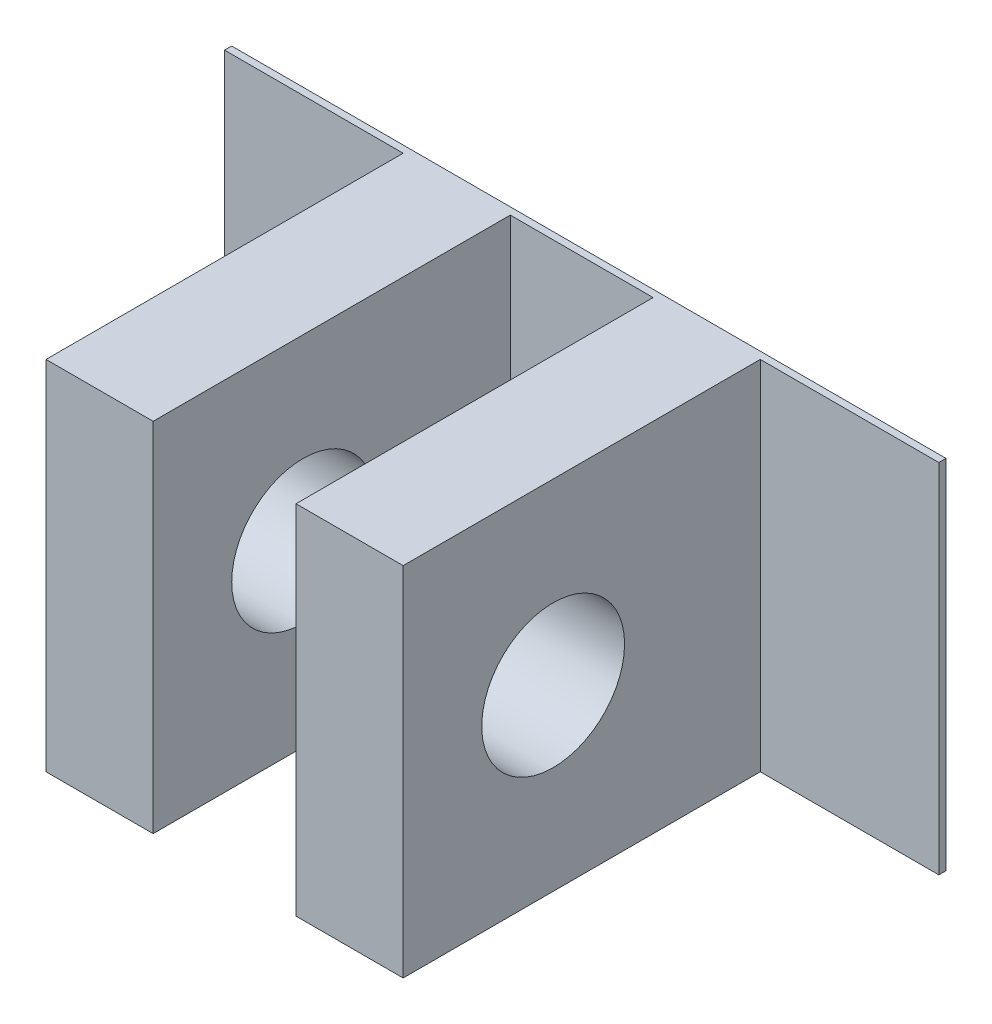
ISO-10303-21;
HEADER;
FILE_DESCRIPTION(('STEP AP214'),'2;1');
FILE_NAME('part.step','',(''),(''),'','','');
FILE_SCHEMA(('AUTOMOTIVE_DESIGN { 1 0 10303 214 1 1 1 1 }'));
ENDSEC;
DATA;
#1=APPLICATION_CONTEXT('core data for automotive mechanical design processes');
#2=APPLICATION_PROTOCOL_DEFINITION('international standard','automotive_design',2000,#1);
#3=PRODUCT_CONTEXT('',#1,'mechanical');
#4=PRODUCT('Part','Part','',(#3));
#5=PRODUCT_RELATED_PRODUCT_CATEGORY('part','',(#4));
#6=PRODUCT_DEFINITION_FORMATION('','',#4);
#7=PRODUCT_DEFINITION_CONTEXT('part definition',#1,'design');
#8=PRODUCT_DEFINITION('design','',#6,#7);
#9=PRODUCT_DEFINITION_SHAPE('','',#8);
#10=(LENGTH_UNIT() NAMED_UNIT(*) SI_UNIT(.MILLI.,.METRE.));
#11=(NAMED_UNIT(*) PLANE_ANGLE_UNIT() SI_UNIT($,.RADIAN.));
#12=(NAMED_UNIT(*) SI_UNIT($,.STERADIAN.) SOLID_ANGLE_UNIT());
#13=UNCERTAINTY_MEASURE_WITH_UNIT(LENGTH_MEASURE(1.E-05),#10,'distance_accuracy_value','');
#14=(GEOMETRIC_REPRESENTATION_CONTEXT(3) GLOBAL_UNCERTAINTY_ASSIGNED_CONTEXT((#13)) GLOBAL_UNIT_ASSIGNED_CONTEXT((#10,
#11,#12)) REPRESENTATION_CONTEXT('',''));
#15=CARTESIAN_POINT('',(0.,0.,0.));
#16=DIRECTION('',(0.,0.,1.));
#17=DIRECTION('',(1.,0.,0.));
#18=AXIS2_PLACEMENT_3D('',#15,#16,#17);
#19=CARTESIAN_POINT('',(0.,0.,0.508));
#20=DIRECTION('',(0.,0.,1.));
#21=DIRECTION('',(1.,0.,0.));
#22=AXIS2_PLACEMENT_3D('',#19,#20,#21);
#23=PLANE('',#22);
#24=DIRECTION('',(0.,-1.,0.));
#25=VECTOR('',#24,1.);
#26=CARTESIAN_POINT('',(8.17191388107751,0.,0.508));
#27=LINE('',#26,#25);
#28=CARTESIAN_POINT('',(8.17191388107751,13.6400641311125,0.508));
#29=VERTEX_POINT('',#28);
#30=CARTESIAN_POINT('',(8.17191388107751,-11.7599358688875,0.508000000000002));
#31=VERTEX_POINT('',#30);
#32=EDGE_CURVE('E11',#29,#31,#27,.T.);
#33=ORIENTED_EDGE('',*,*,#32,.F.);
#34=DIRECTION('',(1.,0.,0.));
#35=VECTOR('',#34,1.);
#36=CARTESIAN_POINT('',(0.,13.6400641311125,0.508));
#37=LINE('',#36,#35);
#38=CARTESIAN_POINT('',(-1.9880861189225,13.6400641311125,0.508000000000002));
#39=VERTEX_POINT('',#38);
#40=EDGE_CURVE('E254',#39,#29,#37,.T.);
#41=ORIENTED_EDGE('',*,*,#40,.F.);
#42=DIRECTION('',(0.,-1.,0.));
#43=VECTOR('',#42,1.);
#44=CARTESIAN_POINT('',(-1.9880861189225,0.,0.508));
#45=LINE('',#44,#43);
#46=CARTESIAN_POINT('',(-1.9880861189225,-11.7599358688875,0.508));
#47=VERTEX_POINT('',#46);
#48=EDGE_CURVE('E60',#39,#47,#45,.T.);
#49=ORIENTED_EDGE('',*,*,#48,.T.);
#50=DIRECTION('',(-1.,0.,0.));
#51=VECTOR('',#50,1.);
#52=CARTESIAN_POINT('',(0.,-11.7599358688875,0.508));
#53=LINE('',#52,#51);
#54=EDGE_CURVE('E253',#31,#47,#53,.T.);
#55=ORIENTED_EDGE('',*,*,#54,.F.);
#56=EDGE_LOOP('',(#33,#41,#49,#55));
#57=FACE_BOUND('',#56,.T.);
#58=ADVANCED_FACE('F50',(#57),#23,.T.);
#59=CARTESIAN_POINT('',(0.,-11.7599358688875,0.508));
#60=DIRECTION('',(0.,-1.,0.));
#61=DIRECTION('',(0.,0.,-1.));
#62=AXIS2_PLACEMENT_3D('',#59,#60,#61);
#63=PLANE('',#62);
#64=DIRECTION('',(0.,0.,-1.));
#65=VECTOR('',#64,1.);
#66=CARTESIAN_POINT('',(-9.6080861189225,-11.7599358688875,0.508));
#67=LINE('',#66,#65);
#68=CARTESIAN_POINT('',(-9.6080861189225,-11.7599358688875,25.908));
#69=VERTEX_POINT('',#68);
#70=CARTESIAN_POINT('',(-9.6080861189225,-11.7599358688875,0.508));
#71=VERTEX_POINT('',#70);
#72=EDGE_CURVE('E141',#69,#71,#67,.T.);
#73=ORIENTED_EDGE('',*,*,#72,.T.);
#74=DIRECTION('',(1.,0.,0.));
#75=VECTOR('',#74,1.);
#76=CARTESIAN_POINT('',(0.,-11.7599358688875,0.508));
#77=LINE('',#76,#75);
#78=CARTESIAN_POINT('',(-22.3080861189225,-11.7599358688875,0.508));
#79=VERTEX_POINT('',#78);
#80=EDGE_CURVE('E75',#79,#71,#77,.T.);
#81=ORIENTED_EDGE('',*,*,#80,.F.);
#82=DIRECTION('',(0.,0.,-1.));
#83=VECTOR('',#82,1.);
#84=CARTESIAN_POINT('',(-22.3080861189225,-11.7599358688875,0.508));
#85=LINE('',#84,#83);
#86=CARTESIAN_POINT('',(-22.3080861189225,-11.7599358688875,0.));
#87=VERTEX_POINT('',#86);
#88=EDGE_CURVE('E137',#79,#87,#85,.T.);
#89=ORIENTED_EDGE('',*,*,#88,.T.);
#90=DIRECTION('',(-1.,0.,0.));
#91=VECTOR('',#90,1.);
#92=CARTESIAN_POINT('',(0.,-11.7599358688875,0.));
#93=LINE('',#92,#91);
#94=CARTESIAN_POINT('',(28.4919138810775,-11.7599358688875,0.));
#95=VERTEX_POINT('',#94);
#96=EDGE_CURVE('E227',#95,#87,#93,.T.);
#97=ORIENTED_EDGE('',*,*,#96,.F.);
#98=DIRECTION('',(0.,0.,-1.));
#99=VECTOR('',#98,1.);
#100=CARTESIAN_POINT('',(28.4919138810775,-11.7599358688875,0.508));
#101=LINE('',#100,#99);
#102=CARTESIAN_POINT('',(28.4919138810775,-11.7599358688875,0.508));
#103=VERTEX_POINT('',#102);
#104=EDGE_CURVE('E195',#103,#95,#101,.T.);
#105=ORIENTED_EDGE('',*,*,#104,.F.);
#106=DIRECTION('',(-1.,0.,0.));
#107=VECTOR('',#106,1.);
#108=CARTESIAN_POINT('',(0.,-11.7599358688875,0.508));
#109=LINE('',#108,#107);
#110=CARTESIAN_POINT('',(15.7919138810775,-11.7599358688875,0.508));
#111=VERTEX_POINT('',#110);
#112=EDGE_CURVE('E174',#103,#111,#109,.T.);
#113=ORIENTED_EDGE('',*,*,#112,.T.);
#114=DIRECTION('',(0.,0.,-1.));
#115=VECTOR('',#114,1.);
#116=CARTESIAN_POINT('',(15.7919138810775,-11.7599358688875,0.508));
#117=LINE('',#116,#115);
#118=CARTESIAN_POINT('',(15.7919138810775,-11.7599358688875,25.908));
#119=VERTEX_POINT('',#118);
#120=EDGE_CURVE('E272',#119,#111,#117,.T.);
#121=ORIENTED_EDGE('',*,*,#120,.F.);
#122=DIRECTION('',(-1.,0.,0.));
#123=VECTOR('',#122,1.);
#124=CARTESIAN_POINT('',(0.,-11.7599358688875,25.908));
#125=LINE('',#124,#123);
#126=CARTESIAN_POINT('',(8.17191388107751,-11.7599358688875,25.908));
#127=VERTEX_POINT('',#126);
#128=EDGE_CURVE('E207',#119,#127,#125,.T.);
#129=ORIENTED_EDGE('',*,*,#128,.T.);
#130=DIRECTION('',(0.,0.,-1.));
#131=VECTOR('',#130,1.);
#132=CARTESIAN_POINT('',(8.17191388107751,-11.7599358688875,25.908));
#133=LINE('',#132,#131);
#134=EDGE_CURVE('E229',#127,#31,#133,.T.);
#135=ORIENTED_EDGE('',*,*,#134,.T.);
#136=ORIENTED_EDGE('',*,*,#54,.T.);
#137=DIRECTION('',(0.,0.,-1.));
#138=VECTOR('',#137,1.);
#139=CARTESIAN_POINT('',(-1.9880861189225,-11.7599358688875,25.908));
#140=LINE('',#139,#138);
#141=CARTESIAN_POINT('',(-1.9880861189225,-11.7599358688875,25.908));
#142=VERTEX_POINT('',#141);
#143=EDGE_CURVE('E242',#142,#47,#140,.T.);
#144=ORIENTED_EDGE('',*,*,#143,.F.);
#145=DIRECTION('',(1.,0.,0.));
#146=VECTOR('',#145,1.);
#147=CARTESIAN_POINT('',(0.,-11.7599358688875,25.908));
#148=LINE('',#147,#146);
#149=EDGE_CURVE('E241',#69,#142,#148,.T.);
#150=ORIENTED_EDGE('',*,*,#149,.F.);
#151=EDGE_LOOP('',(#73,#81,#89,#97,#105,#113,#121,#129,#135,#136,#144,#150));
#152=FACE_BOUND('',#151,.T.);
#153=ADVANCED_FACE('F47',(#152),#63,.T.);
#154=CARTESIAN_POINT('',(15.7919138810775,0.,0.508));
#155=DIRECTION('',(1.,0.,0.));
#156=DIRECTION('',(0.,0.,-1.));
#157=AXIS2_PLACEMENT_3D('',#154,#155,#156);
#158=PLANE('',#157);
#159=DIRECTION('',(0.,-1.,0.));
#160=VECTOR('',#159,1.);
#161=CARTESIAN_POINT('',(15.7919138810775,0.,0.508));
#162=LINE('',#161,#160);
#163=CARTESIAN_POINT('',(15.7919138810775,13.6400641311125,0.508));
#164=VERTEX_POINT('',#163);
#165=EDGE_CURVE('E63',#164,#111,#162,.T.);
#166=ORIENTED_EDGE('',*,*,#165,.F.);
#167=DIRECTION('',(0.,0.,-1.));
#168=VECTOR('',#167,1.);
#169=CARTESIAN_POINT('',(15.7919138810775,13.6400641311125,0.508));
#170=LINE('',#169,#168);
#171=CARTESIAN_POINT('',(15.7919138810775,13.6400641311125,25.908));
#172=VERTEX_POINT('',#171);
#173=EDGE_CURVE('E269',#172,#164,#170,.T.);
#174=ORIENTED_EDGE('',*,*,#173,.F.);
#175=DIRECTION('',(0.,-1.,0.));
#176=VECTOR('',#175,1.);
#177=CARTESIAN_POINT('',(15.7919138810775,0.,25.908));
#178=LINE('',#177,#176);
#179=EDGE_CURVE('E212',#172,#119,#178,.T.);
#180=ORIENTED_EDGE('',*,*,#179,.T.);
#181=ORIENTED_EDGE('',*,*,#120,.T.);
#182=EDGE_LOOP('',(#166,#174,#180,#181));
#183=FACE_BOUND('',#182,.T.);
#184=CARTESIAN_POINT('',(15.7919138810775,0.940064131112497,15.24));
#185=DIRECTION('',(1.,0.,0.));
#186=DIRECTION('',(0.,0.,-1.));
#187=AXIS2_PLACEMENT_3D('',#184,#185,#186);
#188=CIRCLE('',#187,5.08);
#189=CARTESIAN_POINT('',(15.7919138810775,0.940064131112497,10.16));
#190=VERTEX_POINT('',#189);
#191=EDGE_CURVE('E159',#190,#190,#188,.T.);
#192=ORIENTED_EDGE('',*,*,#191,.F.);
#193=EDGE_LOOP('',(#192));
#194=FACE_BOUND('',#193,.T.);
#195=ADVANCED_FACE('F312',(#183,#194),#158,.T.);
#196=CARTESIAN_POINT('',(0.,13.6400641311125,0.508));
#197=DIRECTION('',(0.,1.,0.));
#198=DIRECTION('',(0.,0.,1.));
#199=AXIS2_PLACEMENT_3D('',#196,#197,#198);
#200=PLANE('',#199);
#201=ORIENTED_EDGE('',*,*,#173,.T.);
#202=DIRECTION('',(1.,0.,0.));
#203=VECTOR('',#202,1.);
#204=CARTESIAN_POINT('',(0.,13.6400641311125,0.508));
#205=LINE('',#204,#203);
#206=CARTESIAN_POINT('',(28.4919138810775,13.6400641311125,0.508));
#207=VERTEX_POINT('',#206);
#208=EDGE_CURVE('E177',#164,#207,#205,.T.);
#209=ORIENTED_EDGE('',*,*,#208,.T.);
#210=DIRECTION('',(0.,0.,-1.));
#211=VECTOR('',#210,1.);
#212=CARTESIAN_POINT('',(28.4919138810775,13.6400641311125,0.508));
#213=LINE('',#212,#211);
#214=CARTESIAN_POINT('',(28.4919138810775,13.6400641311125,0.));
#215=VERTEX_POINT('',#214);
#216=EDGE_CURVE('E189',#207,#215,#213,.T.);
#217=ORIENTED_EDGE('',*,*,#216,.T.);
#218=DIRECTION('',(1.,0.,0.));
#219=VECTOR('',#218,1.);
#220=CARTESIAN_POINT('',(0.,13.6400641311125,0.));
#221=LINE('',#220,#219);
#222=CARTESIAN_POINT('',(-22.3080861189225,13.6400641311125,0.));
#223=VERTEX_POINT('',#222);
#224=EDGE_CURVE('E258',#223,#215,#221,.T.);
#225=ORIENTED_EDGE('',*,*,#224,.F.);
#226=DIRECTION('',(0.,0.,-1.));
#227=VECTOR('',#226,1.);
#228=CARTESIAN_POINT('',(-22.3080861189225,13.6400641311125,0.508));
#229=LINE('',#228,#227);
#230=CARTESIAN_POINT('',(-22.3080861189225,13.6400641311125,0.508));
#231=VERTEX_POINT('',#230);
#232=EDGE_CURVE('E161',#231,#223,#229,.T.);
#233=ORIENTED_EDGE('',*,*,#232,.F.);
#234=DIRECTION('',(-1.,0.,0.));
#235=VECTOR('',#234,1.);
#236=CARTESIAN_POINT('',(0.,13.6400641311125,0.508));
#237=LINE('',#236,#235);
#238=CARTESIAN_POINT('',(-9.6080861189225,13.6400641311125,0.508));
#239=VERTEX_POINT('',#238);
#240=EDGE_CURVE('E147',#239,#231,#237,.T.);
#241=ORIENTED_EDGE('',*,*,#240,.F.);
#242=DIRECTION('',(0.,0.,-1.));
#243=VECTOR('',#242,1.);
#244=CARTESIAN_POINT('',(-9.6080861189225,13.6400641311125,0.508));
#245=LINE('',#244,#243);
#246=CARTESIAN_POINT('',(-9.6080861189225,13.6400641311125,25.908));
#247=VERTEX_POINT('',#246);
#248=EDGE_CURVE('E266',#247,#239,#245,.T.);
#249=ORIENTED_EDGE('',*,*,#248,.F.);
#250=DIRECTION('',(-1.,0.,0.));
#251=VECTOR('',#250,1.);
#252=CARTESIAN_POINT('',(0.,13.6400641311125,25.908));
#253=LINE('',#252,#251);
#254=CARTESIAN_POINT('',(-1.9880861189225,13.6400641311125,25.908));
#255=VERTEX_POINT('',#254);
#256=EDGE_CURVE('E233',#255,#247,#253,.T.);
#257=ORIENTED_EDGE('',*,*,#256,.F.);
#258=DIRECTION('',(0.,0.,-1.));
#259=VECTOR('',#258,1.);
#260=CARTESIAN_POINT('',(-1.9880861189225,13.6400641311125,25.908));
#261=LINE('',#260,#259);
#262=EDGE_CURVE('E209',#255,#39,#261,.T.);
#263=ORIENTED_EDGE('',*,*,#262,.T.);
#264=ORIENTED_EDGE('',*,*,#40,.T.);
#265=DIRECTION('',(0.,0.,-1.));
#266=VECTOR('',#265,1.);
#267=CARTESIAN_POINT('',(8.17191388107751,13.6400641311125,25.908));
#268=LINE('',#267,#266);
#269=CARTESIAN_POINT('',(8.17191388107751,13.6400641311125,25.908));
#270=VERTEX_POINT('',#269);
#271=EDGE_CURVE('E225',#270,#29,#268,.T.);
#272=ORIENTED_EDGE('',*,*,#271,.F.);
#273=DIRECTION('',(1.,0.,0.));
#274=VECTOR('',#273,1.);
#275=CARTESIAN_POINT('',(0.,13.6400641311125,25.908));
#276=LINE('',#275,#274);
#277=EDGE_CURVE('E217',#270,#172,#276,.T.);
#278=ORIENTED_EDGE('',*,*,#277,.T.);
#279=EDGE_LOOP('',(#201,#209,#217,#225,#233,#241,#249,#257,#263,#264,#272,#278));
#280=FACE_BOUND('',#279,.T.);
#281=ADVANCED_FACE('F291',(#280),#200,.T.);
#282=CARTESIAN_POINT('',(-9.6080861189225,0.,0.508));
#283=DIRECTION('',(1.,0.,0.));
#284=DIRECTION('',(0.,0.,-1.));
#285=AXIS2_PLACEMENT_3D('',#282,#283,#284);
#286=PLANE('',#285);
#287=CARTESIAN_POINT('',(-9.60808611892249,0.940064131112497,15.24));
#288=DIRECTION('',(1.,0.,0.));
#289=DIRECTION('',(0.,0.,-1.));
#290=AXIS2_PLACEMENT_3D('',#287,#288,#289);
#291=CIRCLE('',#290,5.08);
#292=CARTESIAN_POINT('',(-9.60808611892249,0.940064131112497,10.16));
#293=VERTEX_POINT('',#292);
#294=EDGE_CURVE('E167',#293,#293,#291,.T.);
#295=ORIENTED_EDGE('',*,*,#294,.T.);
#296=EDGE_LOOP('',(#295));
#297=FACE_BOUND('',#296,.T.);
#298=ORIENTED_EDGE('',*,*,#248,.T.);
#299=DIRECTION('',(0.,-1.,0.));
#300=VECTOR('',#299,1.);
#301=CARTESIAN_POINT('',(-9.6080861189225,0.,0.508));
#302=LINE('',#301,#300);
#303=EDGE_CURVE('E144',#239,#71,#302,.T.);
#304=ORIENTED_EDGE('',*,*,#303,.T.);
#305=ORIENTED_EDGE('',*,*,#72,.F.);
#306=DIRECTION('',(0.,-1.,0.));
#307=VECTOR('',#306,1.);
#308=CARTESIAN_POINT('',(-9.6080861189225,0.,25.908));
#309=LINE('',#308,#307);
#310=EDGE_CURVE('E236',#247,#69,#309,.T.);
#311=ORIENTED_EDGE('',*,*,#310,.F.);
#312=EDGE_LOOP('',(#298,#304,#305,#311));
#313=FACE_BOUND('',#312,.T.);
#314=ADVANCED_FACE('F297',(#297,#313),#286,.F.);
#315=CARTESIAN_POINT('',(0.,0.,0.));
#316=DIRECTION('',(0.,0.,1.));
#317=DIRECTION('',(1.,0.,0.));
#318=AXIS2_PLACEMENT_3D('',#315,#316,#317);
#319=PLANE('',#318);
#320=ORIENTED_EDGE('',*,*,#96,.T.);
#321=DIRECTION('',(0.,-1.,0.));
#322=VECTOR('',#321,1.);
#323=CARTESIAN_POINT('',(-22.3080861189225,0.,0.));
#324=LINE('',#323,#322);
#325=EDGE_CURVE('E154',#223,#87,#324,.T.);
#326=ORIENTED_EDGE('',*,*,#325,.F.);
#327=ORIENTED_EDGE('',*,*,#224,.T.);
#328=DIRECTION('',(0.,-1.,0.));
#329=VECTOR('',#328,1.);
#330=CARTESIAN_POINT('',(28.4919138810775,0.,0.));
#331=LINE('',#330,#329);
#332=EDGE_CURVE('E179',#215,#95,#331,.T.);
#333=ORIENTED_EDGE('',*,*,#332,.T.);
#334=EDGE_LOOP('',(#320,#326,#327,#333));
#335=FACE_BOUND('',#334,.T.);
#336=ADVANCED_FACE('F307',(#335),#319,.F.);
#337=CARTESIAN_POINT('',(-1.9880861189225,0.,25.908));
#338=DIRECTION('',(-1.,0.,0.));
#339=DIRECTION('',(0.,0.,1.));
#340=AXIS2_PLACEMENT_3D('',#337,#338,#339);
#341=PLANE('',#340);
#342=CARTESIAN_POINT('',(-1.9880861189225,0.940064131112497,15.24));
#343=DIRECTION('',(-1.,0.,0.));
#344=DIRECTION('',(0.,0.,1.));
#345=AXIS2_PLACEMENT_3D('',#342,#343,#344);
#346=CIRCLE('',#345,5.08);
#347=CARTESIAN_POINT('',(-1.9880861189225,0.940064131112497,20.32));
#348=VERTEX_POINT('',#347);
#349=EDGE_CURVE('E199',#348,#348,#346,.T.);
#350=ORIENTED_EDGE('',*,*,#349,.T.);
#351=EDGE_LOOP('',(#350));
#352=FACE_BOUND('',#351,.T.);
#353=ORIENTED_EDGE('',*,*,#48,.F.);
#354=ORIENTED_EDGE('',*,*,#262,.F.);
#355=DIRECTION('',(0.,1.,0.));
#356=VECTOR('',#355,1.);
#357=CARTESIAN_POINT('',(-1.9880861189225,0.,25.908));
#358=LINE('',#357,#356);
#359=EDGE_CURVE('E204',#142,#255,#358,.T.);
#360=ORIENTED_EDGE('',*,*,#359,.F.);
#361=ORIENTED_EDGE('',*,*,#143,.T.);
#362=EDGE_LOOP('',(#353,#354,#360,#361));
#363=FACE_BOUND('',#362,.T.);
#364=ADVANCED_FACE('F293',(#352,#363),#341,.F.);
#365=CARTESIAN_POINT('',(0.,0.,25.908));
#366=DIRECTION('',(0.,0.,1.));
#367=DIRECTION('',(1.,0.,0.));
#368=AXIS2_PLACEMENT_3D('',#365,#366,#367);
#369=PLANE('',#368);
#370=ORIENTED_EDGE('',*,*,#359,.T.);
#371=ORIENTED_EDGE('',*,*,#256,.T.);
#372=ORIENTED_EDGE('',*,*,#310,.T.);
#373=ORIENTED_EDGE('',*,*,#149,.T.);
#374=EDGE_LOOP('',(#370,#371,#372,#373));
#375=FACE_BOUND('',#374,.T.);
#376=ADVANCED_FACE('F296',(#375),#369,.T.);
#377=CARTESIAN_POINT('',(8.17191388107751,0.,25.908));
#378=DIRECTION('',(-1.,0.,0.));
#379=DIRECTION('',(0.,0.,1.));
#380=AXIS2_PLACEMENT_3D('',#377,#378,#379);
#381=PLANE('',#380);
#382=CARTESIAN_POINT('',(8.17191388107751,0.940064131112497,15.24));
#383=DIRECTION('',(-1.,0.,0.));
#384=DIRECTION('',(0.,0.,1.));
#385=AXIS2_PLACEMENT_3D('',#382,#383,#384);
#386=CIRCLE('',#385,5.08);
#387=CARTESIAN_POINT('',(8.17191388107751,0.940064131112497,20.32));
#388=VERTEX_POINT('',#387);
#389=EDGE_CURVE('E51',#388,#388,#386,.T.);
#390=ORIENTED_EDGE('',*,*,#389,.F.);
#391=EDGE_LOOP('',(#390));
#392=FACE_BOUND('',#391,.T.);
#393=ORIENTED_EDGE('',*,*,#271,.T.);
#394=ORIENTED_EDGE('',*,*,#32,.T.);
#395=ORIENTED_EDGE('',*,*,#134,.F.);
#396=DIRECTION('',(0.,1.,0.));
#397=VECTOR('',#396,1.);
#398=CARTESIAN_POINT('',(8.17191388107751,0.,25.908));
#399=LINE('',#398,#397);
#400=EDGE_CURVE('E202',#127,#270,#399,.T.);
#401=ORIENTED_EDGE('',*,*,#400,.T.);
#402=EDGE_LOOP('',(#393,#394,#395,#401));
#403=FACE_BOUND('',#402,.T.);
#404=ADVANCED_FACE('F286',(#392,#403),#381,.T.);
#405=CARTESIAN_POINT('',(0.,0.,25.908));
#406=DIRECTION('',(0.,0.,1.));
#407=DIRECTION('',(1.,0.,0.));
#408=AXIS2_PLACEMENT_3D('',#405,#406,#407);
#409=PLANE('',#408);
#410=ORIENTED_EDGE('',*,*,#400,.F.);
#411=ORIENTED_EDGE('',*,*,#128,.F.);
#412=ORIENTED_EDGE('',*,*,#179,.F.);
#413=ORIENTED_EDGE('',*,*,#277,.F.);
#414=EDGE_LOOP('',(#410,#411,#412,#413));
#415=FACE_BOUND('',#414,.T.);
#416=ADVANCED_FACE('F287',(#415),#409,.T.);
#417=CARTESIAN_POINT('',(-9.60808611892249,0.940064131112497,15.24));
#418=DIRECTION('',(1.,0.,0.));
#419=DIRECTION('',(0.,0.,-1.));
#420=AXIS2_PLACEMENT_3D('',#417,#418,#419);
#421=CYLINDRICAL_SURFACE('',#420,5.08);
#422=ORIENTED_EDGE('',*,*,#389,.T.);
#423=EDGE_LOOP('',(#422));
#424=FACE_BOUND('',#423,.T.);
#425=ORIENTED_EDGE('',*,*,#191,.T.);
#426=EDGE_LOOP('',(#425));
#427=FACE_BOUND('',#426,.T.);
#428=ADVANCED_FACE('F319',(#424,#427),#421,.F.);
#429=ORIENTED_EDGE('',*,*,#294,.F.);
#430=EDGE_LOOP('',(#429));
#431=FACE_BOUND('',#430,.T.);
#432=ORIENTED_EDGE('',*,*,#349,.F.);
#433=EDGE_LOOP('',(#432));
#434=FACE_BOUND('',#433,.T.);
#435=ADVANCED_FACE('F325',(#431,#434),#421,.F.);
#436=CARTESIAN_POINT('',(-22.3080861189225,0.,0.508));
#437=DIRECTION('',(1.,0.,0.));
#438=DIRECTION('',(0.,0.,-1.));
#439=AXIS2_PLACEMENT_3D('',#436,#437,#438);
#440=PLANE('',#439);
#441=ORIENTED_EDGE('',*,*,#325,.T.);
#442=ORIENTED_EDGE('',*,*,#88,.F.);
#443=DIRECTION('',(0.,-1.,0.));
#444=VECTOR('',#443,1.);
#445=CARTESIAN_POINT('',(-22.3080861189225,0.,0.508));
#446=LINE('',#445,#444);
#447=EDGE_CURVE('E148',#231,#79,#446,.T.);
#448=ORIENTED_EDGE('',*,*,#447,.F.);
#449=ORIENTED_EDGE('',*,*,#232,.T.);
#450=EDGE_LOOP('',(#441,#442,#448,#449));
#451=FACE_BOUND('',#450,.T.);
#452=ADVANCED_FACE('F160',(#451),#440,.F.);
#453=CARTESIAN_POINT('',(0.,0.,0.508));
#454=DIRECTION('',(0.,0.,1.));
#455=DIRECTION('',(1.,0.,0.));
#456=AXIS2_PLACEMENT_3D('',#453,#454,#455);
#457=PLANE('',#456);
#458=ORIENTED_EDGE('',*,*,#447,.T.);
#459=ORIENTED_EDGE('',*,*,#80,.T.);
#460=ORIENTED_EDGE('',*,*,#303,.F.);
#461=ORIENTED_EDGE('',*,*,#240,.T.);
#462=EDGE_LOOP('',(#458,#459,#460,#461));
#463=FACE_BOUND('',#462,.T.);
#464=ADVANCED_FACE('F149',(#463),#457,.T.);
#465=CARTESIAN_POINT('',(28.4919138810775,0.,0.508));
#466=DIRECTION('',(1.,0.,0.));
#467=DIRECTION('',(0.,0.,-1.));
#468=AXIS2_PLACEMENT_3D('',#465,#466,#467);
#469=PLANE('',#468);
#470=ORIENTED_EDGE('',*,*,#332,.F.);
#471=ORIENTED_EDGE('',*,*,#216,.F.);
#472=DIRECTION('',(0.,-1.,0.));
#473=VECTOR('',#472,1.);
#474=CARTESIAN_POINT('',(28.4919138810775,0.,0.508));
#475=LINE('',#474,#473);
#476=EDGE_CURVE('E172',#207,#103,#475,.T.);
#477=ORIENTED_EDGE('',*,*,#476,.T.);
#478=ORIENTED_EDGE('',*,*,#104,.T.);
#479=EDGE_LOOP('',(#470,#471,#477,#478));
#480=FACE_BOUND('',#479,.T.);
#481=ADVANCED_FACE('F313',(#480),#469,.T.);
#482=CARTESIAN_POINT('',(0.,0.,0.508));
#483=DIRECTION('',(0.,0.,1.));
#484=DIRECTION('',(1.,0.,0.));
#485=AXIS2_PLACEMENT_3D('',#482,#483,#484);
#486=PLANE('',#485);
#487=ORIENTED_EDGE('',*,*,#112,.F.);
#488=ORIENTED_EDGE('',*,*,#476,.F.);
#489=ORIENTED_EDGE('',*,*,#208,.F.);
#490=ORIENTED_EDGE('',*,*,#165,.T.);
#491=EDGE_LOOP('',(#487,#488,#489,#490));
#492=FACE_BOUND('',#491,.T.);
#493=ADVANCED_FACE('F314',(#492),#486,.T.);
#494=CLOSED_SHELL('',(#58,#153,#195,#281,#314,#336,#364,#376,#404,#416,#428,#435,#452,#464,#481,#493));
#495=MANIFOLD_SOLID_BREP('B2',#494);
#496=ADVANCED_BREP_SHAPE_REPRESENTATION('',(#18,#495),#14);
#497=SHAPE_DEFINITION_REPRESENTATION(#9,#496);
ENDSEC;
END-ISO-10303-21;
